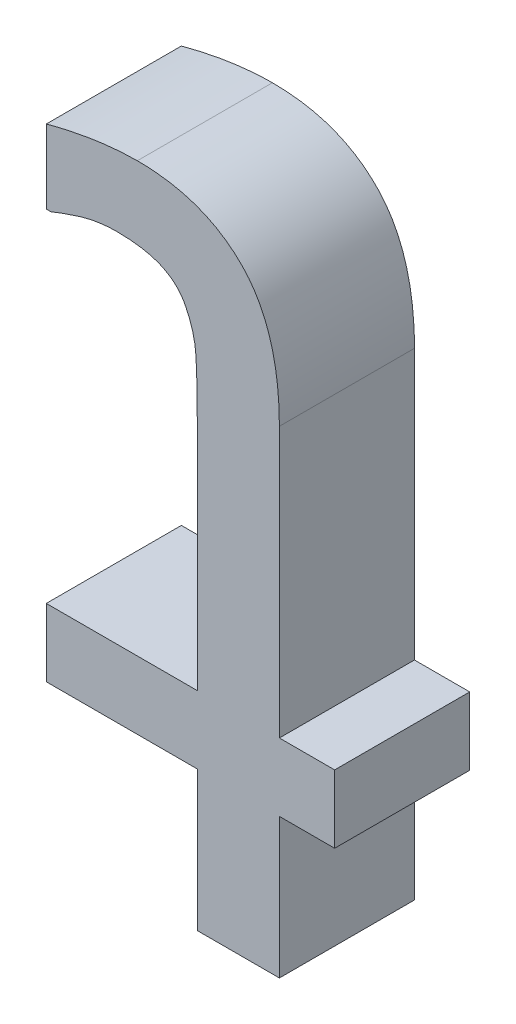
ISO-10303-21;
HEADER;
FILE_DESCRIPTION(('STEP AP214'),'2;1');
FILE_NAME('part.step','',(''),(''),'','','');
FILE_SCHEMA(('AUTOMOTIVE_DESIGN { 1 0 10303 214 1 1 1 1 }'));
ENDSEC;
DATA;
#1=APPLICATION_CONTEXT('core data for automotive mechanical design processes');
#2=APPLICATION_PROTOCOL_DEFINITION('international standard','automotive_design',2000,#1);
#3=PRODUCT_CONTEXT('',#1,'mechanical');
#4=PRODUCT('Part','Part','',(#3));
#5=PRODUCT_RELATED_PRODUCT_CATEGORY('part','',(#4));
#6=PRODUCT_DEFINITION_FORMATION('','',#4);
#7=PRODUCT_DEFINITION_CONTEXT('part definition',#1,'design');
#8=PRODUCT_DEFINITION('design','',#6,#7);
#9=PRODUCT_DEFINITION_SHAPE('','',#8);
#10=(LENGTH_UNIT() NAMED_UNIT(*) SI_UNIT(.MILLI.,.METRE.));
#11=(NAMED_UNIT(*) PLANE_ANGLE_UNIT() SI_UNIT($,.RADIAN.));
#12=(NAMED_UNIT(*) SI_UNIT($,.STERADIAN.) SOLID_ANGLE_UNIT());
#13=UNCERTAINTY_MEASURE_WITH_UNIT(LENGTH_MEASURE(1.E-05),#10,'distance_accuracy_value','');
#14=(GEOMETRIC_REPRESENTATION_CONTEXT(3) GLOBAL_UNCERTAINTY_ASSIGNED_CONTEXT((#13)) GLOBAL_UNIT_ASSIGNED_CONTEXT((#10,
#11,#12)) REPRESENTATION_CONTEXT('',''));
#15=CARTESIAN_POINT('',(0.,0.,0.));
#16=DIRECTION('',(0.,0.,1.));
#17=DIRECTION('',(1.,0.,0.));
#18=AXIS2_PLACEMENT_3D('',#15,#16,#17);
#19=CARTESIAN_POINT('',(-8.744195888934,-7.817386692137,0.));
#20=DIRECTION('',(1.,0.,0.));
#21=DIRECTION('',(0.,1.,0.));
#22=AXIS2_PLACEMENT_3D('',#19,#20,#21);
#23=PLANE('',#22);
#24=DIRECTION('',(0.,-1.,0.));
#25=VECTOR('',#24,1.);
#26=CARTESIAN_POINT('',(-8.744195888934,-7.617537329113,0.));
#27=LINE('',#26,#25);
#28=CARTESIAN_POINT('',(-8.744195888934,-7.617537329113,0.));
#29=VERTEX_POINT('',#28);
#30=CARTESIAN_POINT('',(-8.744195888934,-7.817386692137,0.));
#31=VERTEX_POINT('',#30);
#32=EDGE_CURVE('E11',#29,#31,#27,.T.);
#33=ORIENTED_EDGE('',*,*,#32,.F.);
#34=DIRECTION('',(0.,0.,1.));
#35=VECTOR('',#34,1.);
#36=CARTESIAN_POINT('',(-8.744195888934,-7.617537329113,0.));
#37=LINE('',#36,#35);
#38=CARTESIAN_POINT('',(-8.744195888934,-7.617537329113,0.1));
#39=VERTEX_POINT('',#38);
#40=EDGE_CURVE('E24',#29,#39,#37,.T.);
#41=ORIENTED_EDGE('',*,*,#40,.T.);
#42=DIRECTION('',(0.,1.,0.));
#43=VECTOR('',#42,1.);
#44=CARTESIAN_POINT('',(-8.744195888934,-7.617537329113,0.1));
#45=LINE('',#44,#43);
#46=CARTESIAN_POINT('',(-8.744195888934,-7.817386692137,0.1));
#47=VERTEX_POINT('',#46);
#48=EDGE_CURVE('E160',#47,#39,#45,.T.);
#49=ORIENTED_EDGE('',*,*,#48,.F.);
#50=DIRECTION('',(0.,0.,1.));
#51=VECTOR('',#50,1.);
#52=CARTESIAN_POINT('',(-8.744195888934,-7.817386692137,0.));
#53=LINE('',#52,#51);
#54=EDGE_CURVE('E331',#31,#47,#53,.T.);
#55=ORIENTED_EDGE('',*,*,#54,.F.);
#56=EDGE_LOOP('',(#33,#41,#49,#55));
#57=FACE_BOUND('',#56,.T.);
#58=ADVANCED_FACE('F17',(#57),#23,.T.);
#59=CARTESIAN_POINT('',(-8.703291048549,-7.817386692137,0.));
#60=DIRECTION('',(0.,1.,0.));
#61=DIRECTION('',(-1.,0.,0.));
#62=AXIS2_PLACEMENT_3D('',#59,#60,#61);
#63=PLANE('',#62);
#64=DIRECTION('',(1.,0.,0.));
#65=VECTOR('',#64,1.);
#66=CARTESIAN_POINT('',(-8.744195888934,-7.817386692137,0.));
#67=LINE('',#66,#65);
#68=CARTESIAN_POINT('',(-8.703291048549,-7.817386692137,0.));
#69=VERTEX_POINT('',#68);
#70=EDGE_CURVE('E329',#31,#69,#67,.T.);
#71=ORIENTED_EDGE('',*,*,#70,.F.);
#72=ORIENTED_EDGE('',*,*,#54,.T.);
#73=DIRECTION('',(-1.,0.,0.));
#74=VECTOR('',#73,1.);
#75=CARTESIAN_POINT('',(-8.744195888934,-7.817386692137,0.1));
#76=LINE('',#75,#74);
#77=CARTESIAN_POINT('',(-8.703291048549,-7.817386692137,0.1));
#78=VERTEX_POINT('',#77);
#79=EDGE_CURVE('E327',#78,#47,#76,.T.);
#80=ORIENTED_EDGE('',*,*,#79,.F.);
#81=DIRECTION('',(0.,0.,1.));
#82=VECTOR('',#81,1.);
#83=CARTESIAN_POINT('',(-8.703291048549,-7.817386692137,0.));
#84=LINE('',#83,#82);
#85=EDGE_CURVE('E324',#69,#78,#84,.T.);
#86=ORIENTED_EDGE('',*,*,#85,.F.);
#87=EDGE_LOOP('',(#71,#72,#80,#86));
#88=FACE_BOUND('',#87,.T.);
#89=ADVANCED_FACE('F393',(#88),#63,.T.);
#90=CARTESIAN_POINT('',(-8.703291048549,-7.867641210324,0.));
#91=DIRECTION('',(1.,0.,0.));
#92=DIRECTION('',(0.,1.,0.));
#93=AXIS2_PLACEMENT_3D('',#90,#91,#92);
#94=PLANE('',#93);
#95=DIRECTION('',(0.,-1.,0.));
#96=VECTOR('',#95,1.);
#97=CARTESIAN_POINT('',(-8.703291048549,-7.817386692137,0.));
#98=LINE('',#97,#96);
#99=CARTESIAN_POINT('',(-8.703291048549,-7.867641210324,0.));
#100=VERTEX_POINT('',#99);
#101=EDGE_CURVE('E322',#69,#100,#98,.T.);
#102=ORIENTED_EDGE('',*,*,#101,.F.);
#103=ORIENTED_EDGE('',*,*,#85,.T.);
#104=DIRECTION('',(0.,1.,0.));
#105=VECTOR('',#104,1.);
#106=CARTESIAN_POINT('',(-8.703291048549,-7.817386692137,0.1));
#107=LINE('',#106,#105);
#108=CARTESIAN_POINT('',(-8.703291048549,-7.867641210324,0.1));
#109=VERTEX_POINT('',#108);
#110=EDGE_CURVE('E319',#109,#78,#107,.T.);
#111=ORIENTED_EDGE('',*,*,#110,.F.);
#112=DIRECTION('',(0.,0.,1.));
#113=VECTOR('',#112,1.);
#114=CARTESIAN_POINT('',(-8.703291048549,-7.867641210324,0.));
#115=LINE('',#114,#113);
#116=EDGE_CURVE('E316',#100,#109,#115,.T.);
#117=ORIENTED_EDGE('',*,*,#116,.F.);
#118=EDGE_LOOP('',(#102,#103,#111,#117));
#119=FACE_BOUND('',#118,.T.);
#120=ADVANCED_FACE('F389',(#119),#94,.T.);
#121=CARTESIAN_POINT('',(-8.744195888934,-7.867641210324,0.));
#122=DIRECTION('',(0.,-1.,0.));
#123=DIRECTION('',(1.,0.,0.));
#124=AXIS2_PLACEMENT_3D('',#121,#122,#123);
#125=PLANE('',#124);
#126=DIRECTION('',(-1.,0.,0.));
#127=VECTOR('',#126,1.);
#128=CARTESIAN_POINT('',(-8.703291048549,-7.867641210324,0.));
#129=LINE('',#128,#127);
#130=CARTESIAN_POINT('',(-8.744195888934,-7.867641210324,0.));
#131=VERTEX_POINT('',#130);
#132=EDGE_CURVE('E314',#100,#131,#129,.T.);
#133=ORIENTED_EDGE('',*,*,#132,.F.);
#134=ORIENTED_EDGE('',*,*,#116,.T.);
#135=DIRECTION('',(1.,0.,0.));
#136=VECTOR('',#135,1.);
#137=CARTESIAN_POINT('',(-8.703291048549,-7.867641210324,0.1));
#138=LINE('',#137,#136);
#139=CARTESIAN_POINT('',(-8.744195888934,-7.867641210324,0.1));
#140=VERTEX_POINT('',#139);
#141=EDGE_CURVE('E311',#140,#109,#138,.T.);
#142=ORIENTED_EDGE('',*,*,#141,.F.);
#143=DIRECTION('',(0.,0.,1.));
#144=VECTOR('',#143,1.);
#145=CARTESIAN_POINT('',(-8.744195888934,-7.867641210324,0.));
#146=LINE('',#145,#144);
#147=EDGE_CURVE('E308',#131,#140,#146,.T.);
#148=ORIENTED_EDGE('',*,*,#147,.F.);
#149=EDGE_LOOP('',(#133,#134,#142,#148));
#150=FACE_BOUND('',#149,.T.);
#151=ADVANCED_FACE('F385',(#150),#125,.T.);
#152=CARTESIAN_POINT('',(-8.744195888934,-7.971266805966,0.));
#153=DIRECTION('',(1.,0.,0.));
#154=DIRECTION('',(0.,1.,0.));
#155=AXIS2_PLACEMENT_3D('',#152,#153,#154);
#156=PLANE('',#155);
#157=DIRECTION('',(0.,-1.,0.));
#158=VECTOR('',#157,1.);
#159=CARTESIAN_POINT('',(-8.744195888934,-7.867641210324,0.));
#160=LINE('',#159,#158);
#161=CARTESIAN_POINT('',(-8.744195888934,-7.971266805966,0.));
#162=VERTEX_POINT('',#161);
#163=EDGE_CURVE('E306',#131,#162,#160,.T.);
#164=ORIENTED_EDGE('',*,*,#163,.F.);
#165=ORIENTED_EDGE('',*,*,#147,.T.);
#166=DIRECTION('',(0.,1.,0.));
#167=VECTOR('',#166,1.);
#168=CARTESIAN_POINT('',(-8.744195888934,-7.867641210324,0.1));
#169=LINE('',#168,#167);
#170=CARTESIAN_POINT('',(-8.744195888934,-7.971266805966,0.1));
#171=VERTEX_POINT('',#170);
#172=EDGE_CURVE('E303',#171,#140,#169,.T.);
#173=ORIENTED_EDGE('',*,*,#172,.F.);
#174=DIRECTION('',(0.,0.,1.));
#175=VECTOR('',#174,1.);
#176=CARTESIAN_POINT('',(-8.744195888934,-7.971266805966,0.));
#177=LINE('',#176,#175);
#178=EDGE_CURVE('E300',#162,#171,#177,.T.);
#179=ORIENTED_EDGE('',*,*,#178,.F.);
#180=EDGE_LOOP('',(#164,#165,#173,#179));
#181=FACE_BOUND('',#180,.T.);
#182=ADVANCED_FACE('F381',(#181),#156,.T.);
#183=CARTESIAN_POINT('',(-8.804968794649,-7.971266805966,0.));
#184=DIRECTION('',(0.,-1.,0.));
#185=DIRECTION('',(1.,0.,0.));
#186=AXIS2_PLACEMENT_3D('',#183,#184,#185);
#187=PLANE('',#186);
#188=DIRECTION('',(-1.,0.,0.));
#189=VECTOR('',#188,1.);
#190=CARTESIAN_POINT('',(-8.744195888934,-7.971266805966,0.));
#191=LINE('',#190,#189);
#192=CARTESIAN_POINT('',(-8.804968794649,-7.971266805966,0.));
#193=VERTEX_POINT('',#192);
#194=EDGE_CURVE('E298',#162,#193,#191,.T.);
#195=ORIENTED_EDGE('',*,*,#194,.F.);
#196=ORIENTED_EDGE('',*,*,#178,.T.);
#197=DIRECTION('',(1.,0.,0.));
#198=VECTOR('',#197,1.);
#199=CARTESIAN_POINT('',(-8.744195888934,-7.971266805966,0.1));
#200=LINE('',#199,#198);
#201=CARTESIAN_POINT('',(-8.804968794649,-7.971266805966,0.1));
#202=VERTEX_POINT('',#201);
#203=EDGE_CURVE('E295',#202,#171,#200,.T.);
#204=ORIENTED_EDGE('',*,*,#203,.F.);
#205=DIRECTION('',(0.,0.,1.));
#206=VECTOR('',#205,1.);
#207=CARTESIAN_POINT('',(-8.804968794649,-7.971266805966,0.));
#208=LINE('',#207,#206);
#209=EDGE_CURVE('E292',#193,#202,#208,.T.);
#210=ORIENTED_EDGE('',*,*,#209,.F.);
#211=EDGE_LOOP('',(#195,#196,#204,#210));
#212=FACE_BOUND('',#211,.T.);
#213=ADVANCED_FACE('F377',(#212),#187,.T.);
#214=CARTESIAN_POINT('',(-8.804968794649,-7.867641210324,0.));
#215=DIRECTION('',(-1.,0.,0.));
#216=DIRECTION('',(0.,-1.,0.));
#217=AXIS2_PLACEMENT_3D('',#214,#215,#216);
#218=PLANE('',#217);
#219=DIRECTION('',(0.,1.,0.));
#220=VECTOR('',#219,1.);
#221=CARTESIAN_POINT('',(-8.804968794649,-7.971266805966,0.));
#222=LINE('',#221,#220);
#223=CARTESIAN_POINT('',(-8.804968794649,-7.867641210324,0.));
#224=VERTEX_POINT('',#223);
#225=EDGE_CURVE('E290',#193,#224,#222,.T.);
#226=ORIENTED_EDGE('',*,*,#225,.F.);
#227=ORIENTED_EDGE('',*,*,#209,.T.);
#228=DIRECTION('',(0.,-1.,0.));
#229=VECTOR('',#228,1.);
#230=CARTESIAN_POINT('',(-8.804968794649,-7.971266805966,0.1));
#231=LINE('',#230,#229);
#232=CARTESIAN_POINT('',(-8.804968794649,-7.867641210324,0.1));
#233=VERTEX_POINT('',#232);
#234=EDGE_CURVE('E287',#233,#202,#231,.T.);
#235=ORIENTED_EDGE('',*,*,#234,.F.);
#236=DIRECTION('',(0.,0.,1.));
#237=VECTOR('',#236,1.);
#238=CARTESIAN_POINT('',(-8.804968794649,-7.867641210324,0.));
#239=LINE('',#238,#237);
#240=EDGE_CURVE('E284',#224,#233,#239,.T.);
#241=ORIENTED_EDGE('',*,*,#240,.F.);
#242=EDGE_LOOP('',(#226,#227,#235,#241));
#243=FACE_BOUND('',#242,.T.);
#244=ADVANCED_FACE('F373',(#243),#218,.T.);
#245=CARTESIAN_POINT('',(-8.916775358368,-7.867641210324,0.));
#246=DIRECTION('',(0.,-1.,0.));
#247=DIRECTION('',(1.,0.,0.));
#248=AXIS2_PLACEMENT_3D('',#245,#246,#247);
#249=PLANE('',#248);
#250=DIRECTION('',(-1.,0.,0.));
#251=VECTOR('',#250,1.);
#252=CARTESIAN_POINT('',(-8.804968794649,-7.867641210324,0.));
#253=LINE('',#252,#251);
#254=CARTESIAN_POINT('',(-8.916775358368,-7.867641210324,0.));
#255=VERTEX_POINT('',#254);
#256=EDGE_CURVE('E282',#224,#255,#253,.T.);
#257=ORIENTED_EDGE('',*,*,#256,.F.);
#258=ORIENTED_EDGE('',*,*,#240,.T.);
#259=DIRECTION('',(1.,0.,0.));
#260=VECTOR('',#259,1.);
#261=CARTESIAN_POINT('',(-8.804968794649,-7.867641210324,0.1));
#262=LINE('',#261,#260);
#263=CARTESIAN_POINT('',(-8.916775358368,-7.867641210324,0.1));
#264=VERTEX_POINT('',#263);
#265=EDGE_CURVE('E279',#264,#233,#262,.T.);
#266=ORIENTED_EDGE('',*,*,#265,.F.);
#267=DIRECTION('',(0.,0.,1.));
#268=VECTOR('',#267,1.);
#269=CARTESIAN_POINT('',(-8.916775358368,-7.867641210324,0.));
#270=LINE('',#269,#268);
#271=EDGE_CURVE('E276',#255,#264,#270,.T.);
#272=ORIENTED_EDGE('',*,*,#271,.F.);
#273=EDGE_LOOP('',(#257,#258,#266,#272));
#274=FACE_BOUND('',#273,.T.);
#275=ADVANCED_FACE('F369',(#274),#249,.T.);
#276=CARTESIAN_POINT('',(-8.916775358368,-7.817386692137,0.));
#277=DIRECTION('',(-1.,0.,0.));
#278=DIRECTION('',(0.,-1.,0.));
#279=AXIS2_PLACEMENT_3D('',#276,#277,#278);
#280=PLANE('',#279);
#281=DIRECTION('',(0.,1.,0.));
#282=VECTOR('',#281,1.);
#283=CARTESIAN_POINT('',(-8.916775358368,-7.867641210324,0.));
#284=LINE('',#283,#282);
#285=CARTESIAN_POINT('',(-8.916775358368,-7.817386692137,0.));
#286=VERTEX_POINT('',#285);
#287=EDGE_CURVE('E274',#255,#286,#284,.T.);
#288=ORIENTED_EDGE('',*,*,#287,.F.);
#289=ORIENTED_EDGE('',*,*,#271,.T.);
#290=DIRECTION('',(0.,-1.,0.));
#291=VECTOR('',#290,1.);
#292=CARTESIAN_POINT('',(-8.916775358368,-7.867641210324,0.1));
#293=LINE('',#292,#291);
#294=CARTESIAN_POINT('',(-8.916775358368,-7.817386692137,0.1));
#295=VERTEX_POINT('',#294);
#296=EDGE_CURVE('E271',#295,#264,#293,.T.);
#297=ORIENTED_EDGE('',*,*,#296,.F.);
#298=DIRECTION('',(0.,0.,1.));
#299=VECTOR('',#298,1.);
#300=CARTESIAN_POINT('',(-8.916775358368,-7.817386692137,0.));
#301=LINE('',#300,#299);
#302=EDGE_CURVE('E268',#286,#295,#301,.T.);
#303=ORIENTED_EDGE('',*,*,#302,.F.);
#304=EDGE_LOOP('',(#288,#289,#297,#303));
#305=FACE_BOUND('',#304,.T.);
#306=ADVANCED_FACE('F365',(#305),#280,.T.);
#307=CARTESIAN_POINT('',(-8.804968794649,-7.817386692137,0.));
#308=DIRECTION('',(0.,1.,0.));
#309=DIRECTION('',(-1.,0.,0.));
#310=AXIS2_PLACEMENT_3D('',#307,#308,#309);
#311=PLANE('',#310);
#312=DIRECTION('',(1.,0.,0.));
#313=VECTOR('',#312,1.);
#314=CARTESIAN_POINT('',(-8.916775358368,-7.817386692137,0.));
#315=LINE('',#314,#313);
#316=CARTESIAN_POINT('',(-8.804968794649,-7.817386692137,0.));
#317=VERTEX_POINT('',#316);
#318=EDGE_CURVE('E266',#286,#317,#315,.T.);
#319=ORIENTED_EDGE('',*,*,#318,.F.);
#320=ORIENTED_EDGE('',*,*,#302,.T.);
#321=DIRECTION('',(-1.,0.,0.));
#322=VECTOR('',#321,1.);
#323=CARTESIAN_POINT('',(-8.916775358368,-7.817386692137,0.1));
#324=LINE('',#323,#322);
#325=CARTESIAN_POINT('',(-8.804968794649,-7.817386692137,0.1));
#326=VERTEX_POINT('',#325);
#327=EDGE_CURVE('E263',#326,#295,#324,.T.);
#328=ORIENTED_EDGE('',*,*,#327,.F.);
#329=DIRECTION('',(0.,0.,1.));
#330=VECTOR('',#329,1.);
#331=CARTESIAN_POINT('',(-8.804968794649,-7.817386692137,0.));
#332=LINE('',#331,#330);
#333=EDGE_CURVE('E260',#317,#326,#332,.T.);
#334=ORIENTED_EDGE('',*,*,#333,.F.);
#335=EDGE_LOOP('',(#319,#320,#328,#334));
#336=FACE_BOUND('',#335,.T.);
#337=ADVANCED_FACE('F361',(#336),#311,.T.);
#338=CARTESIAN_POINT('',(-8.804968794649,-7.64558636252,0.));
#339=DIRECTION('',(-1.,0.,0.));
#340=DIRECTION('',(0.,-1.,0.));
#341=AXIS2_PLACEMENT_3D('',#338,#339,#340);
#342=PLANE('',#341);
#343=DIRECTION('',(0.,1.,0.));
#344=VECTOR('',#343,1.);
#345=CARTESIAN_POINT('',(-8.804968794649,-7.817386692137,0.));
#346=LINE('',#345,#344);
#347=CARTESIAN_POINT('',(-8.804968794649,-7.64558636252,0.));
#348=VERTEX_POINT('',#347);
#349=EDGE_CURVE('E258',#317,#348,#346,.T.);
#350=ORIENTED_EDGE('',*,*,#349,.F.);
#351=ORIENTED_EDGE('',*,*,#333,.T.);
#352=DIRECTION('',(0.,-1.,0.));
#353=VECTOR('',#352,1.);
#354=CARTESIAN_POINT('',(-8.804968794649,-7.817386692137,0.1));
#355=LINE('',#354,#353);
#356=CARTESIAN_POINT('',(-8.804968794649,-7.64558636252,0.1));
#357=VERTEX_POINT('',#356);
#358=EDGE_CURVE('E255',#357,#326,#355,.T.);
#359=ORIENTED_EDGE('',*,*,#358,.F.);
#360=DIRECTION('',(0.,0.,1.));
#361=VECTOR('',#360,1.);
#362=CARTESIAN_POINT('',(-8.804968794649,-7.64558636252,0.));
#363=LINE('',#362,#361);
#364=EDGE_CURVE('E249',#348,#357,#363,.T.);
#365=ORIENTED_EDGE('',*,*,#364,.F.);
#366=EDGE_LOOP('',(#350,#351,#359,#365));
#367=FACE_BOUND('',#366,.T.);
#368=ADVANCED_FACE('F357',(#367),#342,.T.);
#369=CARTESIAN_POINT('',(-8.813539332634,-7.575463779003,0.));
#370=CARTESIAN_POINT('',(-8.813539332634,-7.575463779003,0.1));
#371=CARTESIAN_POINT('',(-8.806916644191,-7.588319585981,0.));
#372=CARTESIAN_POINT('',(-8.806916644191,-7.588319585981,0.1));
#373=CARTESIAN_POINT('',(-8.804968794649,-7.61831646893,0.));
#374=CARTESIAN_POINT('',(-8.804968794649,-7.61831646893,0.1));
#375=CARTESIAN_POINT('',(-8.804968794649,-7.64558636252,0.));
#376=CARTESIAN_POINT('',(-8.804968794649,-7.64558636252,0.1));
#377=B_SPLINE_SURFACE_WITH_KNOTS('',2,1,((#369,#370),(#371,#372),(#373,#374),(#375,#376)),
.UNSPECIFIED.,.F.,.F.,.F.,(3,1,3),(2,2),(-2.,-1.,0.),(0.,0.01),.UNSPECIFIED.);
#378=CARTESIAN_POINT('',(-8.804968794649,-7.64558636252,0.));
#379=CARTESIAN_POINT('',(-8.804968794649,-7.61831646893,0.));
#380=CARTESIAN_POINT('',(-8.806916644191,-7.588319585981,0.));
#381=CARTESIAN_POINT('',(-8.813539332634,-7.575463779003,0.));
#382=B_SPLINE_CURVE_WITH_KNOTS('',2,(#378,#379,#380,#381),.UNSPECIFIED.,.F.,.F.,(3,1,3),(0.,1.,
2.),.UNSPECIFIED.);
#383=CARTESIAN_POINT('',(-8.813539332634,-7.575463779003,0.));
#384=VERTEX_POINT('',#383);
#385=EDGE_CURVE('E242',#348,#384,#382,.T.);
#386=CARTESIAN_POINT('',(-8.813539332634,-7.575463779003,0.1));
#387=CARTESIAN_POINT('',(-8.806916644191,-7.588319585981,0.1));
#388=CARTESIAN_POINT('',(-8.804968794649,-7.61831646893,0.1));
#389=CARTESIAN_POINT('',(-8.804968794649,-7.64558636252,0.1));
#390=B_SPLINE_CURVE_WITH_KNOTS('',2,(#386,#387,#388,#389),.UNSPECIFIED.,.F.,.F.,(3,1,3),(-2.,
-1.,0.),.UNSPECIFIED.);
#391=CARTESIAN_POINT('',(-8.813539332634,-7.575463779003,0.1));
#392=VERTEX_POINT('',#391);
#393=EDGE_CURVE('E237',#392,#357,#390,.T.);
#394=DIRECTION('',(0.,0.,1.));
#395=VECTOR('',#394,1.);
#396=CARTESIAN_POINT('',(-8.813539332634,-7.575463779003,0.));
#397=LINE('',#396,#395);
#398=EDGE_CURVE('E231',#384,#392,#397,.T.);
#399=ORIENTED_EDGE('',*,*,#385,.F.);
#400=ORIENTED_EDGE('',*,*,#364,.T.);
#401=ORIENTED_EDGE('',*,*,#393,.F.);
#402=ORIENTED_EDGE('',*,*,#398,.F.);
#403=EDGE_LOOP('',(#399,#400,#401,#402));
#404=FACE_BOUND('',#403,.T.);
#405=ADVANCED_FACE('F353',(#404),#377,.T.);
#406=CARTESIAN_POINT('',(-8.864572990639,-7.552868724314,0.));
#407=CARTESIAN_POINT('',(-8.864572990639,-7.552868724314,0.1));
#408=CARTESIAN_POINT('',(-8.843536215583,-7.552868724314,0.));
#409=CARTESIAN_POINT('',(-8.843536215583,-7.552868724314,0.1));
#410=CARTESIAN_POINT('',(-8.818993311352,-7.564166251658,0.));
#411=CARTESIAN_POINT('',(-8.818993311352,-7.564166251658,0.1));
#412=CARTESIAN_POINT('',(-8.813539332634,-7.575463779003,0.));
#413=CARTESIAN_POINT('',(-8.813539332634,-7.575463779003,0.1));
#414=B_SPLINE_SURFACE_WITH_KNOTS('',2,1,((#406,#407),(#408,#409),(#410,#411),(#412,#413)),
.UNSPECIFIED.,.F.,.F.,.F.,(3,1,3),(2,2),(-2.,-1.,0.),(0.,0.01),.UNSPECIFIED.);
#415=CARTESIAN_POINT('',(-8.813539332634,-7.575463779003,0.));
#416=CARTESIAN_POINT('',(-8.818993311352,-7.564166251658,0.));
#417=CARTESIAN_POINT('',(-8.843536215583,-7.552868724314,0.));
#418=CARTESIAN_POINT('',(-8.864572990639,-7.552868724314,0.));
#419=B_SPLINE_CURVE_WITH_KNOTS('',2,(#415,#416,#417,#418),.UNSPECIFIED.,.F.,.F.,(3,1,3),(0.,1.,
2.),.UNSPECIFIED.);
#420=CARTESIAN_POINT('',(-8.864572990639,-7.552868724314,0.));
#421=VERTEX_POINT('',#420);
#422=EDGE_CURVE('E224',#384,#421,#419,.T.);
#423=CARTESIAN_POINT('',(-8.864572990639,-7.552868724314,0.1));
#424=CARTESIAN_POINT('',(-8.843536215583,-7.552868724314,0.1));
#425=CARTESIAN_POINT('',(-8.818993311352,-7.564166251658,0.1));
#426=CARTESIAN_POINT('',(-8.813539332634,-7.575463779003,0.1));
#427=B_SPLINE_CURVE_WITH_KNOTS('',2,(#423,#424,#425,#426),.UNSPECIFIED.,.F.,.F.,(3,1,3),(-2.,
-1.,0.),.UNSPECIFIED.);
#428=CARTESIAN_POINT('',(-8.864572990639,-7.552868724314,0.1));
#429=VERTEX_POINT('',#428);
#430=EDGE_CURVE('E219',#429,#392,#427,.T.);
#431=DIRECTION('',(0.,0.,1.));
#432=VECTOR('',#431,1.);
#433=CARTESIAN_POINT('',(-8.864572990639,-7.552868724314,0.));
#434=LINE('',#433,#432);
#435=EDGE_CURVE('E213',#421,#429,#434,.T.);
#436=ORIENTED_EDGE('',*,*,#422,.F.);
#437=ORIENTED_EDGE('',*,*,#398,.T.);
#438=ORIENTED_EDGE('',*,*,#430,.F.);
#439=ORIENTED_EDGE('',*,*,#435,.F.);
#440=EDGE_LOOP('',(#436,#437,#438,#439));
#441=FACE_BOUND('',#440,.T.);
#442=ADVANCED_FACE('F349',(#441),#414,.T.);
#443=CARTESIAN_POINT('',(-8.913269229192,-7.564555821567,0.));
#444=CARTESIAN_POINT('',(-8.913269229192,-7.564555821567,0.1));
#445=CARTESIAN_POINT('',(-8.907036110657,-7.561828832208,0.));
#446=CARTESIAN_POINT('',(-8.907036110657,-7.561828832208,0.1));
#447=CARTESIAN_POINT('',(-8.879376647159,-7.552868724314,0.));
#448=CARTESIAN_POINT('',(-8.879376647159,-7.552868724314,0.1));
#449=CARTESIAN_POINT('',(-8.864572990639,-7.552868724314,0.));
#450=CARTESIAN_POINT('',(-8.864572990639,-7.552868724314,0.1));
#451=B_SPLINE_SURFACE_WITH_KNOTS('',2,1,((#443,#444),(#445,#446),(#447,#448),(#449,#450)),
.UNSPECIFIED.,.F.,.F.,.F.,(3,1,3),(2,2),(-2.,-1.,0.),(0.,0.01),.UNSPECIFIED.);
#452=CARTESIAN_POINT('',(-8.864572990639,-7.552868724314,0.));
#453=CARTESIAN_POINT('',(-8.879376647159,-7.552868724314,0.));
#454=CARTESIAN_POINT('',(-8.907036110657,-7.561828832208,0.));
#455=CARTESIAN_POINT('',(-8.913269229192,-7.564555821567,0.));
#456=B_SPLINE_CURVE_WITH_KNOTS('',2,(#452,#453,#454,#455),.UNSPECIFIED.,.F.,.F.,(3,1,3),(0.,1.,
2.),.UNSPECIFIED.);
#457=CARTESIAN_POINT('',(-8.913269229192,-7.564555821567,0.));
#458=VERTEX_POINT('',#457);
#459=EDGE_CURVE('E206',#421,#458,#456,.T.);
#460=CARTESIAN_POINT('',(-8.913269229192,-7.564555821567,0.1));
#461=CARTESIAN_POINT('',(-8.907036110657,-7.561828832208,0.1));
#462=CARTESIAN_POINT('',(-8.879376647159,-7.552868724314,0.1));
#463=CARTESIAN_POINT('',(-8.864572990639,-7.552868724314,0.1));
#464=B_SPLINE_CURVE_WITH_KNOTS('',2,(#460,#461,#462,#463),.UNSPECIFIED.,.F.,.F.,(3,1,3),(-2.,
-1.,0.),.UNSPECIFIED.);
#465=CARTESIAN_POINT('',(-8.913269229192,-7.564555821567,0.1));
#466=VERTEX_POINT('',#465);
#467=EDGE_CURVE('E201',#466,#429,#464,.T.);
#468=DIRECTION('',(0.,0.,1.));
#469=VECTOR('',#468,1.);
#470=CARTESIAN_POINT('',(-8.913269229192,-7.564555821567,0.));
#471=LINE('',#470,#469);
#472=EDGE_CURVE('E198',#458,#466,#471,.T.);
#473=ORIENTED_EDGE('',*,*,#459,.F.);
#474=ORIENTED_EDGE('',*,*,#435,.T.);
#475=ORIENTED_EDGE('',*,*,#467,.F.);
#476=ORIENTED_EDGE('',*,*,#472,.F.);
#477=EDGE_LOOP('',(#473,#474,#475,#476));
#478=FACE_BOUND('',#477,.T.);
#479=ADVANCED_FACE('F345',(#478),#451,.T.);
#480=CARTESIAN_POINT('',(-8.916775358368,-7.564555821567,0.));
#481=DIRECTION('',(0.,-1.,0.));
#482=DIRECTION('',(1.,0.,0.));
#483=AXIS2_PLACEMENT_3D('',#480,#481,#482);
#484=PLANE('',#483);
#485=DIRECTION('',(-1.,0.,0.));
#486=VECTOR('',#485,1.);
#487=CARTESIAN_POINT('',(-8.913269229192,-7.564555821567,0.));
#488=LINE('',#487,#486);
#489=CARTESIAN_POINT('',(-8.916775358368,-7.564555821567,0.));
#490=VERTEX_POINT('',#489);
#491=EDGE_CURVE('E196',#458,#490,#488,.T.);
#492=ORIENTED_EDGE('',*,*,#491,.F.);
#493=ORIENTED_EDGE('',*,*,#472,.T.);
#494=DIRECTION('',(1.,0.,0.));
#495=VECTOR('',#494,1.);
#496=CARTESIAN_POINT('',(-8.913269229192,-7.564555821567,0.1));
#497=LINE('',#496,#495);
#498=CARTESIAN_POINT('',(-8.916775358368,-7.564555821567,0.1));
#499=VERTEX_POINT('',#498);
#500=EDGE_CURVE('E193',#499,#466,#497,.T.);
#501=ORIENTED_EDGE('',*,*,#500,.F.);
#502=DIRECTION('',(0.,0.,1.));
#503=VECTOR('',#502,1.);
#504=CARTESIAN_POINT('',(-8.916775358368,-7.564555821567,0.));
#505=LINE('',#504,#503);
#506=EDGE_CURVE('E190',#490,#499,#505,.T.);
#507=ORIENTED_EDGE('',*,*,#506,.F.);
#508=EDGE_LOOP('',(#492,#493,#501,#507));
#509=FACE_BOUND('',#508,.T.);
#510=ADVANCED_FACE('F341',(#509),#484,.T.);
#511=CARTESIAN_POINT('',(-8.916775358368,-7.510016034387,0.));
#512=DIRECTION('',(-1.,0.,0.));
#513=DIRECTION('',(0.,-1.,0.));
#514=AXIS2_PLACEMENT_3D('',#511,#512,#513);
#515=PLANE('',#514);
#516=DIRECTION('',(0.,1.,0.));
#517=VECTOR('',#516,1.);
#518=CARTESIAN_POINT('',(-8.916775358368,-7.564555821567,0.));
#519=LINE('',#518,#517);
#520=CARTESIAN_POINT('',(-8.916775358368,-7.510016034387,0.));
#521=VERTEX_POINT('',#520);
#522=EDGE_CURVE('E188',#490,#521,#519,.T.);
#523=ORIENTED_EDGE('',*,*,#522,.F.);
#524=ORIENTED_EDGE('',*,*,#506,.T.);
#525=DIRECTION('',(0.,-1.,0.));
#526=VECTOR('',#525,1.);
#527=CARTESIAN_POINT('',(-8.916775358368,-7.564555821567,0.1));
#528=LINE('',#527,#526);
#529=CARTESIAN_POINT('',(-8.916775358368,-7.510016034387,0.1));
#530=VERTEX_POINT('',#529);
#531=EDGE_CURVE('E186',#530,#499,#528,.T.);
#532=ORIENTED_EDGE('',*,*,#531,.F.);
#533=DIRECTION('',(0.,0.,1.));
#534=VECTOR('',#533,1.);
#535=CARTESIAN_POINT('',(-8.916775358368,-7.510016034387,0.));
#536=LINE('',#535,#534);
#537=EDGE_CURVE('E145',#521,#530,#536,.T.);
#538=ORIENTED_EDGE('',*,*,#537,.F.);
#539=EDGE_LOOP('',(#523,#524,#532,#538));
#540=FACE_BOUND('',#539,.T.);
#541=ADVANCED_FACE('F339',(#540),#515,.T.);
#542=CARTESIAN_POINT('',(-8.84937976421,-7.499887216768,0.));
#543=CARTESIAN_POINT('',(-8.84937976421,-7.499887216768,0.1));
#544=CARTESIAN_POINT('',(-8.864572990639,-7.499887216768,0.));
#545=CARTESIAN_POINT('',(-8.864572990639,-7.499887216768,0.1));
#546=CARTESIAN_POINT('',(-8.899634282397,-7.505341195486,0.));
#547=CARTESIAN_POINT('',(-8.899634282397,-7.505341195486,0.1));
#548=CARTESIAN_POINT('',(-8.916775358368,-7.510016034387,0.));
#549=CARTESIAN_POINT('',(-8.916775358368,-7.510016034387,0.1));
#550=B_SPLINE_SURFACE_WITH_KNOTS('',2,1,((#542,#543),(#544,#545),(#546,#547),(#548,#549)),
.UNSPECIFIED.,.F.,.F.,.F.,(3,1,3),(2,2),(-2.,-1.,0.),(0.,0.01),.UNSPECIFIED.);
#551=CARTESIAN_POINT('',(-8.916775358368,-7.510016034387,0.));
#552=CARTESIAN_POINT('',(-8.899634282397,-7.505341195486,0.));
#553=CARTESIAN_POINT('',(-8.864572990639,-7.499887216768,0.));
#554=CARTESIAN_POINT('',(-8.84937976421,-7.499887216768,0.));
#555=B_SPLINE_CURVE_WITH_KNOTS('',2,(#551,#552,#553,#554),.UNSPECIFIED.,.F.,.F.,(3,1,3),(0.,1.,
2.),.UNSPECIFIED.);
#556=CARTESIAN_POINT('',(-8.84937976421,-7.499887216768,0.));
#557=VERTEX_POINT('',#556);
#558=EDGE_CURVE('E149',#521,#557,#555,.T.);
#559=CARTESIAN_POINT('',(-8.84937976421,-7.499887216768,0.1));
#560=CARTESIAN_POINT('',(-8.864572990639,-7.499887216768,0.1));
#561=CARTESIAN_POINT('',(-8.899634282397,-7.505341195486,0.1));
#562=CARTESIAN_POINT('',(-8.916775358368,-7.510016034387,0.1));
#563=B_SPLINE_CURVE_WITH_KNOTS('',2,(#559,#560,#561,#562),.UNSPECIFIED.,.F.,.F.,(3,1,3),(-2.,
-1.,0.),.UNSPECIFIED.);
#564=CARTESIAN_POINT('',(-8.84937976421,-7.499887216768,0.1));
#565=VERTEX_POINT('',#564);
#566=EDGE_CURVE('E138',#565,#530,#563,.T.);
#567=DIRECTION('',(0.,0.,1.));
#568=VECTOR('',#567,1.);
#569=CARTESIAN_POINT('',(-8.84937976421,-7.499887216768,0.));
#570=LINE('',#569,#568);
#571=EDGE_CURVE('E142',#557,#565,#570,.T.);
#572=ORIENTED_EDGE('',*,*,#558,.F.);
#573=ORIENTED_EDGE('',*,*,#537,.T.);
#574=ORIENTED_EDGE('',*,*,#566,.F.);
#575=ORIENTED_EDGE('',*,*,#571,.F.);
#576=EDGE_LOOP('',(#572,#573,#574,#575));
#577=FACE_BOUND('',#576,.T.);
#578=ADVANCED_FACE('F141',(#577),#550,.T.);
#579=CARTESIAN_POINT('',(-8.744195888934,-7.617537329113,0.));
#580=CARTESIAN_POINT('',(-8.744195888934,-7.617537329113,0.1));
#581=CARTESIAN_POINT('',(-8.744195888934,-7.55637485349,0.));
#582=CARTESIAN_POINT('',(-8.744195888934,-7.55637485349,0.1));
#583=CARTESIAN_POINT('',(-8.799904385839,-7.499887216768,0.));
#584=CARTESIAN_POINT('',(-8.799904385839,-7.499887216768,0.1));
#585=CARTESIAN_POINT('',(-8.84937976421,-7.499887216768,0.));
#586=CARTESIAN_POINT('',(-8.84937976421,-7.499887216768,0.1));
#587=B_SPLINE_SURFACE_WITH_KNOTS('',2,1,((#579,#580),(#581,#582),(#583,#584),(#585,#586)),
.UNSPECIFIED.,.F.,.F.,.F.,(3,1,3),(2,2),(-2.,-1.,0.),(0.,0.01),.UNSPECIFIED.);
#588=CARTESIAN_POINT('',(-8.84937976421,-7.499887216768,0.));
#589=CARTESIAN_POINT('',(-8.799904385839,-7.499887216768,0.));
#590=CARTESIAN_POINT('',(-8.744195888934,-7.55637485349,0.));
#591=CARTESIAN_POINT('',(-8.744195888934,-7.617537329113,0.));
#592=B_SPLINE_CURVE_WITH_KNOTS('',2,(#588,#589,#590,#591),.UNSPECIFIED.,.F.,.F.,(3,1,3),(0.,1.,
2.),.UNSPECIFIED.);
#593=EDGE_CURVE('E155',#557,#29,#592,.T.);
#594=CARTESIAN_POINT('',(-8.744195888934,-7.617537329113,0.1));
#595=CARTESIAN_POINT('',(-8.744195888934,-7.55637485349,0.1));
#596=CARTESIAN_POINT('',(-8.799904385839,-7.499887216768,0.1));
#597=CARTESIAN_POINT('',(-8.84937976421,-7.499887216768,0.1));
#598=B_SPLINE_CURVE_WITH_KNOTS('',2,(#594,#595,#596,#597),.UNSPECIFIED.,.F.,.F.,(3,1,3),(-2.,
-1.,0.),.UNSPECIFIED.);
#599=EDGE_CURVE('E154',#39,#565,#598,.T.);
#600=ORIENTED_EDGE('',*,*,#593,.F.);
#601=ORIENTED_EDGE('',*,*,#571,.T.);
#602=ORIENTED_EDGE('',*,*,#599,.F.);
#603=ORIENTED_EDGE('',*,*,#40,.F.);
#604=EDGE_LOOP('',(#600,#601,#602,#603));
#605=FACE_BOUND('',#604,.T.);
#606=ADVANCED_FACE('F153',(#605),#587,.T.);
#607=CARTESIAN_POINT('',(-8.803360701018,-7.750075514544,0.));
#608=DIRECTION('',(0.,0.,1.));
#609=DIRECTION('',(1.,0.,0.));
#610=AXIS2_PLACEMENT_3D('',#607,#608,#609);
#611=PLANE('',#610);
#612=ORIENTED_EDGE('',*,*,#593,.T.);
#613=ORIENTED_EDGE('',*,*,#32,.T.);
#614=ORIENTED_EDGE('',*,*,#70,.T.);
#615=ORIENTED_EDGE('',*,*,#101,.T.);
#616=ORIENTED_EDGE('',*,*,#132,.T.);
#617=ORIENTED_EDGE('',*,*,#163,.T.);
#618=ORIENTED_EDGE('',*,*,#194,.T.);
#619=ORIENTED_EDGE('',*,*,#225,.T.);
#620=ORIENTED_EDGE('',*,*,#256,.T.);
#621=ORIENTED_EDGE('',*,*,#287,.T.);
#622=ORIENTED_EDGE('',*,*,#318,.T.);
#623=ORIENTED_EDGE('',*,*,#349,.T.);
#624=ORIENTED_EDGE('',*,*,#385,.T.);
#625=ORIENTED_EDGE('',*,*,#422,.T.);
#626=ORIENTED_EDGE('',*,*,#459,.T.);
#627=ORIENTED_EDGE('',*,*,#491,.T.);
#628=ORIENTED_EDGE('',*,*,#522,.T.);
#629=ORIENTED_EDGE('',*,*,#558,.T.);
#630=EDGE_LOOP('',(#612,#613,#614,#615,#616,#617,#618,#619,#620,#621,#622,#623,#624,#625,#626,
#627,#628,#629));
#631=FACE_BOUND('',#630,.T.);
#632=ADVANCED_FACE('F334',(#631),#611,.F.);
#633=CARTESIAN_POINT('',(-8.803360701018,-7.750075514544,0.1));
#634=DIRECTION('',(0.,0.,1.));
#635=DIRECTION('',(1.,0.,0.));
#636=AXIS2_PLACEMENT_3D('',#633,#634,#635);
#637=PLANE('',#636);
#638=ORIENTED_EDGE('',*,*,#599,.T.);
#639=ORIENTED_EDGE('',*,*,#566,.T.);
#640=ORIENTED_EDGE('',*,*,#531,.T.);
#641=ORIENTED_EDGE('',*,*,#500,.T.);
#642=ORIENTED_EDGE('',*,*,#467,.T.);
#643=ORIENTED_EDGE('',*,*,#430,.T.);
#644=ORIENTED_EDGE('',*,*,#393,.T.);
#645=ORIENTED_EDGE('',*,*,#358,.T.);
#646=ORIENTED_EDGE('',*,*,#327,.T.);
#647=ORIENTED_EDGE('',*,*,#296,.T.);
#648=ORIENTED_EDGE('',*,*,#265,.T.);
#649=ORIENTED_EDGE('',*,*,#234,.T.);
#650=ORIENTED_EDGE('',*,*,#203,.T.);
#651=ORIENTED_EDGE('',*,*,#172,.T.);
#652=ORIENTED_EDGE('',*,*,#141,.T.);
#653=ORIENTED_EDGE('',*,*,#110,.T.);
#654=ORIENTED_EDGE('',*,*,#79,.T.);
#655=ORIENTED_EDGE('',*,*,#48,.T.);
#656=EDGE_LOOP('',(#638,#639,#640,#641,#642,#643,#644,#645,#646,#647,#648,#649,#650,#651,#652,
#653,#654,#655));
#657=FACE_BOUND('',#656,.T.);
#658=ADVANCED_FACE('F158',(#657),#637,.T.);
#659=CLOSED_SHELL('',(#58,#89,#120,#151,#182,#213,#244,#275,#306,#337,#368,#405,#442,#479,#510,
#541,#578,#606,#632,#658));
#660=MANIFOLD_SOLID_BREP('B1',#659);
#661=ADVANCED_BREP_SHAPE_REPRESENTATION('',(#18,#660),#14);
#662=SHAPE_DEFINITION_REPRESENTATION(#9,#661);
ENDSEC;
END-ISO-10303-21;
